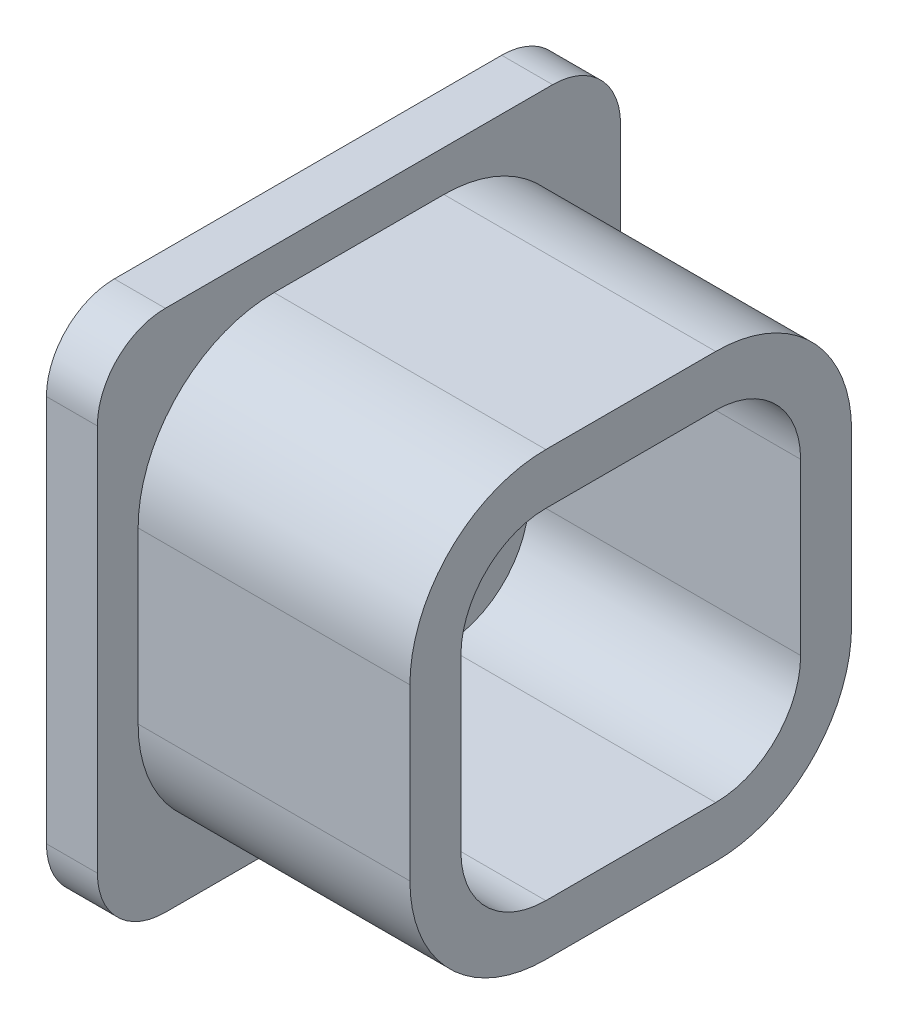
ISO-10303-21;
HEADER;
FILE_DESCRIPTION(('STEP AP214'),'2;1');
FILE_NAME('part.step','',(''),(''),'','','');
FILE_SCHEMA(('AUTOMOTIVE_DESIGN { 1 0 10303 214 1 1 1 1 }'));
ENDSEC;
DATA;
#1=APPLICATION_CONTEXT('core data for automotive mechanical design processes');
#2=APPLICATION_PROTOCOL_DEFINITION('international standard','automotive_design',2000,#1);
#3=PRODUCT_CONTEXT('',#1,'mechanical');
#4=PRODUCT('Part','Part','',(#3));
#5=PRODUCT_RELATED_PRODUCT_CATEGORY('part','',(#4));
#6=PRODUCT_DEFINITION_FORMATION('','',#4);
#7=PRODUCT_DEFINITION_CONTEXT('part definition',#1,'design');
#8=PRODUCT_DEFINITION('design','',#6,#7);
#9=PRODUCT_DEFINITION_SHAPE('','',#8);
#10=(LENGTH_UNIT() NAMED_UNIT(*) SI_UNIT(.MILLI.,.METRE.));
#11=(NAMED_UNIT(*) PLANE_ANGLE_UNIT() SI_UNIT($,.RADIAN.));
#12=(NAMED_UNIT(*) SI_UNIT($,.STERADIAN.) SOLID_ANGLE_UNIT());
#13=UNCERTAINTY_MEASURE_WITH_UNIT(LENGTH_MEASURE(1.E-05),#10,'distance_accuracy_value','');
#14=(GEOMETRIC_REPRESENTATION_CONTEXT(3) GLOBAL_UNCERTAINTY_ASSIGNED_CONTEXT((#13)) GLOBAL_UNIT_ASSIGNED_CONTEXT((#10,
#11,#12)) REPRESENTATION_CONTEXT('',''));
#15=CARTESIAN_POINT('',(0.,0.,0.));
#16=DIRECTION('',(0.,0.,1.));
#17=DIRECTION('',(1.,0.,0.));
#18=AXIS2_PLACEMENT_3D('',#15,#16,#17);
#19=CARTESIAN_POINT('',(9.5,0.,0.));
#20=DIRECTION('',(1.,0.,0.));
#21=DIRECTION('',(0.,0.,-1.));
#22=AXIS2_PLACEMENT_3D('',#19,#20,#21);
#23=PLANE('',#22);
#24=DIRECTION('',(0.,1.,0.));
#25=VECTOR('',#24,1.);
#26=CARTESIAN_POINT('',(9.5,-6.5,-6.5));
#27=LINE('',#26,#25);
#28=CARTESIAN_POINT('',(9.5,2.5,-6.5));
#29=VERTEX_POINT('',#28);
#30=CARTESIAN_POINT('',(9.5,-2.5,-6.5));
#31=VERTEX_POINT('',#30);
#32=EDGE_CURVE('E325',#29,#31,#27,.F.);
#33=ORIENTED_EDGE('',*,*,#32,.F.);
#34=CARTESIAN_POINT('',(9.5,2.5,-2.5));
#35=DIRECTION('',(-1.,0.,0.));
#36=DIRECTION('',(0.,0.,1.));
#37=AXIS2_PLACEMENT_3D('',#34,#35,#36);
#38=CIRCLE('',#37,4.);
#39=CARTESIAN_POINT('',(9.5,6.5,-2.5));
#40=VERTEX_POINT('',#39);
#41=EDGE_CURVE('E291',#40,#29,#38,.T.);
#42=ORIENTED_EDGE('',*,*,#41,.F.);
#43=DIRECTION('',(0.,0.,1.));
#44=VECTOR('',#43,1.);
#45=CARTESIAN_POINT('',(9.5,6.5,-6.5));
#46=LINE('',#45,#44);
#47=CARTESIAN_POINT('',(9.5,6.5,2.5));
#48=VERTEX_POINT('',#47);
#49=EDGE_CURVE('E322',#48,#40,#46,.F.);
#50=ORIENTED_EDGE('',*,*,#49,.F.);
#51=CARTESIAN_POINT('',(9.5,2.5,2.5));
#52=DIRECTION('',(-1.,0.,0.));
#53=DIRECTION('',(0.,0.,1.));
#54=AXIS2_PLACEMENT_3D('',#51,#52,#53);
#55=CIRCLE('',#54,4.);
#56=CARTESIAN_POINT('',(9.5,2.5,6.5));
#57=VERTEX_POINT('',#56);
#58=EDGE_CURVE('E286',#57,#48,#55,.T.);
#59=ORIENTED_EDGE('',*,*,#58,.F.);
#60=DIRECTION('',(0.,1.,0.));
#61=VECTOR('',#60,1.);
#62=CARTESIAN_POINT('',(9.5,6.5,6.5));
#63=LINE('',#62,#61);
#64=CARTESIAN_POINT('',(9.5,-2.5,6.5));
#65=VERTEX_POINT('',#64);
#66=EDGE_CURVE('E318',#65,#57,#63,.T.);
#67=ORIENTED_EDGE('',*,*,#66,.F.);
#68=CARTESIAN_POINT('',(9.5,-2.5,2.5));
#69=DIRECTION('',(-1.,0.,0.));
#70=DIRECTION('',(0.,0.,1.));
#71=AXIS2_PLACEMENT_3D('',#68,#69,#70);
#72=CIRCLE('',#71,4.);
#73=CARTESIAN_POINT('',(9.5,-6.5,2.5));
#74=VERTEX_POINT('',#73);
#75=EDGE_CURVE('E301',#74,#65,#72,.T.);
#76=ORIENTED_EDGE('',*,*,#75,.F.);
#77=DIRECTION('',(0.,0.,-1.));
#78=VECTOR('',#77,1.);
#79=CARTESIAN_POINT('',(9.5,-6.5,6.5));
#80=LINE('',#79,#78);
#81=CARTESIAN_POINT('',(9.5,-6.5,-2.5));
#82=VERTEX_POINT('',#81);
#83=EDGE_CURVE('E328',#82,#74,#80,.F.);
#84=ORIENTED_EDGE('',*,*,#83,.F.);
#85=CARTESIAN_POINT('',(9.5,-2.5,-2.5));
#86=DIRECTION('',(-1.,0.,0.));
#87=DIRECTION('',(0.,0.,1.));
#88=AXIS2_PLACEMENT_3D('',#85,#86,#87);
#89=CIRCLE('',#88,4.);
#90=EDGE_CURVE('E296',#31,#82,#89,.T.);
#91=ORIENTED_EDGE('',*,*,#90,.F.);
#92=EDGE_LOOP('',(#33,#42,#50,#59,#67,#76,#84,#91));
#93=FACE_BOUND('',#92,.T.);
#94=CARTESIAN_POINT('',(9.5,2.5,-2.5));
#95=DIRECTION('',(-1.,0.,0.));
#96=DIRECTION('',(0.,0.,1.));
#97=AXIS2_PLACEMENT_3D('',#94,#95,#96);
#98=CIRCLE('',#97,2.5);
#99=CARTESIAN_POINT('',(9.5,5.,-2.5));
#100=VERTEX_POINT('',#99);
#101=CARTESIAN_POINT('',(9.5,2.5,-5.));
#102=VERTEX_POINT('',#101);
#103=EDGE_CURVE('E305',#100,#102,#98,.T.);
#104=ORIENTED_EDGE('',*,*,#103,.T.);
#105=DIRECTION('',(0.,1.,0.));
#106=VECTOR('',#105,1.);
#107=CARTESIAN_POINT('',(9.5,-6.5,-5.));
#108=LINE('',#107,#106);
#109=CARTESIAN_POINT('',(9.5,-2.5,-5.));
#110=VERTEX_POINT('',#109);
#111=EDGE_CURVE('E331',#102,#110,#108,.F.);
#112=ORIENTED_EDGE('',*,*,#111,.T.);
#113=CARTESIAN_POINT('',(9.5,-2.5,-2.5));
#114=DIRECTION('',(-1.,0.,0.));
#115=DIRECTION('',(0.,0.,1.));
#116=AXIS2_PLACEMENT_3D('',#113,#114,#115);
#117=CIRCLE('',#116,2.5);
#118=CARTESIAN_POINT('',(9.5,-5.,-2.5));
#119=VERTEX_POINT('',#118);
#120=EDGE_CURVE('E307',#110,#119,#117,.T.);
#121=ORIENTED_EDGE('',*,*,#120,.T.);
#122=DIRECTION('',(0.,0.,-1.));
#123=VECTOR('',#122,1.);
#124=CARTESIAN_POINT('',(9.5,-5.,6.5));
#125=LINE('',#124,#123);
#126=CARTESIAN_POINT('',(9.5,-5.,2.5));
#127=VERTEX_POINT('',#126);
#128=EDGE_CURVE('E205',#119,#127,#125,.F.);
#129=ORIENTED_EDGE('',*,*,#128,.T.);
#130=CARTESIAN_POINT('',(9.5,-2.5,2.5));
#131=DIRECTION('',(-1.,0.,0.));
#132=DIRECTION('',(0.,0.,1.));
#133=AXIS2_PLACEMENT_3D('',#130,#131,#132);
#134=CIRCLE('',#133,2.5);
#135=CARTESIAN_POINT('',(9.5,-2.5,5.));
#136=VERTEX_POINT('',#135);
#137=EDGE_CURVE('E197',#127,#136,#134,.T.);
#138=ORIENTED_EDGE('',*,*,#137,.T.);
#139=DIRECTION('',(0.,1.,0.));
#140=VECTOR('',#139,1.);
#141=CARTESIAN_POINT('',(9.5,6.5,5.));
#142=LINE('',#141,#140);
#143=CARTESIAN_POINT('',(9.5,2.5,5.));
#144=VERTEX_POINT('',#143);
#145=EDGE_CURVE('E192',#136,#144,#142,.T.);
#146=ORIENTED_EDGE('',*,*,#145,.T.);
#147=CARTESIAN_POINT('',(9.5,2.5,2.5));
#148=DIRECTION('',(-1.,0.,0.));
#149=DIRECTION('',(0.,0.,1.));
#150=AXIS2_PLACEMENT_3D('',#147,#148,#149);
#151=CIRCLE('',#150,2.5);
#152=CARTESIAN_POINT('',(9.5,5.,2.5));
#153=VERTEX_POINT('',#152);
#154=EDGE_CURVE('E20',#144,#153,#151,.T.);
#155=ORIENTED_EDGE('',*,*,#154,.T.);
#156=DIRECTION('',(0.,0.,1.));
#157=VECTOR('',#156,1.);
#158=CARTESIAN_POINT('',(9.5,5.,-6.5));
#159=LINE('',#158,#157);
#160=EDGE_CURVE('E180',#153,#100,#159,.F.);
#161=ORIENTED_EDGE('',*,*,#160,.T.);
#162=EDGE_LOOP('',(#104,#112,#121,#129,#138,#146,#155,#161));
#163=FACE_BOUND('',#162,.T.);
#164=ADVANCED_FACE('F17',(#93,#163),#23,.T.);
#165=CARTESIAN_POINT('',(0.,5.,-6.5));
#166=DIRECTION('',(0.,1.,0.));
#167=DIRECTION('',(0.,0.,1.));
#168=AXIS2_PLACEMENT_3D('',#165,#166,#167);
#169=PLANE('',#168);
#170=DIRECTION('',(-1.,0.,0.));
#171=VECTOR('',#170,1.);
#172=CARTESIAN_POINT('',(9.532380992134,5.,-2.5));
#173=LINE('',#172,#171);
#174=CARTESIAN_POINT('',(1.5,5.,-2.5));
#175=VERTEX_POINT('',#174);
#176=EDGE_CURVE('E185',#175,#100,#173,.F.);
#177=ORIENTED_EDGE('',*,*,#176,.T.);
#178=ORIENTED_EDGE('',*,*,#160,.F.);
#179=DIRECTION('',(-1.,0.,0.));
#180=VECTOR('',#179,1.);
#181=CARTESIAN_POINT('',(9.532380992134,5.,2.5));
#182=LINE('',#181,#180);
#183=CARTESIAN_POINT('',(1.5,5.,2.5));
#184=VERTEX_POINT('',#183);
#185=EDGE_CURVE('E183',#153,#184,#182,.T.);
#186=ORIENTED_EDGE('',*,*,#185,.T.);
#187=DIRECTION('',(0.,0.,-1.));
#188=VECTOR('',#187,1.);
#189=CARTESIAN_POINT('',(1.5,5.,0.));
#190=LINE('',#189,#188);
#191=EDGE_CURVE('E285',#175,#184,#190,.F.);
#192=ORIENTED_EDGE('',*,*,#191,.F.);
#193=EDGE_LOOP('',(#177,#178,#186,#192));
#194=FACE_BOUND('',#193,.T.);
#195=ADVANCED_FACE('F181',(#194),#169,.F.);
#196=CARTESIAN_POINT('',(9.532380992134,2.5,2.5));
#197=DIRECTION('',(-1.,0.,0.));
#198=DIRECTION('',(0.,0.,1.));
#199=AXIS2_PLACEMENT_3D('',#196,#197,#198);
#200=CYLINDRICAL_SURFACE('',#199,2.5);
#201=ORIENTED_EDGE('',*,*,#185,.F.);
#202=ORIENTED_EDGE('',*,*,#154,.F.);
#203=DIRECTION('',(1.,0.,0.));
#204=VECTOR('',#203,1.);
#205=CARTESIAN_POINT('',(0.,2.5,5.));
#206=LINE('',#205,#204);
#207=CARTESIAN_POINT('',(1.5,2.5,5.));
#208=VERTEX_POINT('',#207);
#209=EDGE_CURVE('E201',#144,#208,#206,.F.);
#210=ORIENTED_EDGE('',*,*,#209,.T.);
#211=CARTESIAN_POINT('',(1.5,2.5,2.5));
#212=DIRECTION('',(-1.,0.,0.));
#213=DIRECTION('',(0.,0.,1.));
#214=AXIS2_PLACEMENT_3D('',#211,#212,#213);
#215=CIRCLE('',#214,2.5);
#216=EDGE_CURVE('E191',#184,#208,#215,.F.);
#217=ORIENTED_EDGE('',*,*,#216,.F.);
#218=EDGE_LOOP('',(#201,#202,#210,#217));
#219=FACE_BOUND('',#218,.T.);
#220=ADVANCED_FACE('F190',(#219),#200,.F.);
#221=CARTESIAN_POINT('',(0.,6.5,5.));
#222=DIRECTION('',(0.,0.,1.));
#223=DIRECTION('',(1.,0.,0.));
#224=AXIS2_PLACEMENT_3D('',#221,#222,#223);
#225=PLANE('',#224);
#226=ORIENTED_EDGE('',*,*,#209,.F.);
#227=ORIENTED_EDGE('',*,*,#145,.F.);
#228=DIRECTION('',(-1.,0.,0.));
#229=VECTOR('',#228,1.);
#230=CARTESIAN_POINT('',(9.532380992134,-2.5,5.));
#231=LINE('',#230,#229);
#232=CARTESIAN_POINT('',(1.5,-2.5,5.));
#233=VERTEX_POINT('',#232);
#234=EDGE_CURVE('E311',#136,#233,#231,.T.);
#235=ORIENTED_EDGE('',*,*,#234,.T.);
#236=DIRECTION('',(0.,1.,0.));
#237=VECTOR('',#236,1.);
#238=CARTESIAN_POINT('',(1.5,0.,5.));
#239=LINE('',#238,#237);
#240=EDGE_CURVE('E283',#208,#233,#239,.F.);
#241=ORIENTED_EDGE('',*,*,#240,.F.);
#242=EDGE_LOOP('',(#226,#227,#235,#241));
#243=FACE_BOUND('',#242,.T.);
#244=ADVANCED_FACE('F524',(#243),#225,.F.);
#245=CARTESIAN_POINT('',(9.532380992134,-2.5,2.5));
#246=DIRECTION('',(-1.,0.,0.));
#247=DIRECTION('',(0.,0.,1.));
#248=AXIS2_PLACEMENT_3D('',#245,#246,#247);
#249=CYLINDRICAL_SURFACE('',#248,2.5);
#250=ORIENTED_EDGE('',*,*,#234,.F.);
#251=ORIENTED_EDGE('',*,*,#137,.F.);
#252=DIRECTION('',(1.,0.,0.));
#253=VECTOR('',#252,1.);
#254=CARTESIAN_POINT('',(0.,-5.,2.5));
#255=LINE('',#254,#253);
#256=CARTESIAN_POINT('',(1.5,-5.,2.5));
#257=VERTEX_POINT('',#256);
#258=EDGE_CURVE('E310',#127,#257,#255,.F.);
#259=ORIENTED_EDGE('',*,*,#258,.T.);
#260=CARTESIAN_POINT('',(1.5,-2.5,2.5));
#261=DIRECTION('',(-1.,0.,0.));
#262=DIRECTION('',(0.,0.,1.));
#263=AXIS2_PLACEMENT_3D('',#260,#261,#262);
#264=CIRCLE('',#263,2.5);
#265=EDGE_CURVE('E281',#233,#257,#264,.F.);
#266=ORIENTED_EDGE('',*,*,#265,.F.);
#267=EDGE_LOOP('',(#250,#251,#259,#266));
#268=FACE_BOUND('',#267,.T.);
#269=ADVANCED_FACE('F521',(#268),#249,.F.);
#270=CARTESIAN_POINT('',(0.,-5.,6.5));
#271=DIRECTION('',(0.,-1.,0.));
#272=DIRECTION('',(0.,0.,-1.));
#273=AXIS2_PLACEMENT_3D('',#270,#271,#272);
#274=PLANE('',#273);
#275=ORIENTED_EDGE('',*,*,#258,.F.);
#276=ORIENTED_EDGE('',*,*,#128,.F.);
#277=DIRECTION('',(-1.,0.,0.));
#278=VECTOR('',#277,1.);
#279=CARTESIAN_POINT('',(9.532380992134,-5.,-2.5));
#280=LINE('',#279,#278);
#281=CARTESIAN_POINT('',(1.5,-5.,-2.5));
#282=VERTEX_POINT('',#281);
#283=EDGE_CURVE('E309',#119,#282,#280,.T.);
#284=ORIENTED_EDGE('',*,*,#283,.T.);
#285=DIRECTION('',(0.,0.,-1.));
#286=VECTOR('',#285,1.);
#287=CARTESIAN_POINT('',(1.5,-5.,0.));
#288=LINE('',#287,#286);
#289=EDGE_CURVE('E280',#257,#282,#288,.T.);
#290=ORIENTED_EDGE('',*,*,#289,.F.);
#291=EDGE_LOOP('',(#275,#276,#284,#290));
#292=FACE_BOUND('',#291,.T.);
#293=ADVANCED_FACE('F517',(#292),#274,.F.);
#294=CARTESIAN_POINT('',(9.532380992134,-2.5,-2.5));
#295=DIRECTION('',(-1.,0.,0.));
#296=DIRECTION('',(0.,0.,1.));
#297=AXIS2_PLACEMENT_3D('',#294,#295,#296);
#298=CYLINDRICAL_SURFACE('',#297,2.5);
#299=ORIENTED_EDGE('',*,*,#283,.F.);
#300=ORIENTED_EDGE('',*,*,#120,.F.);
#301=DIRECTION('',(-1.,0.,0.));
#302=VECTOR('',#301,1.);
#303=CARTESIAN_POINT('',(0.,-2.5,-5.));
#304=LINE('',#303,#302);
#305=CARTESIAN_POINT('',(1.5,-2.5,-5.));
#306=VERTEX_POINT('',#305);
#307=EDGE_CURVE('E333',#110,#306,#304,.T.);
#308=ORIENTED_EDGE('',*,*,#307,.T.);
#309=CARTESIAN_POINT('',(1.5,-2.5,-2.5));
#310=DIRECTION('',(-1.,0.,0.));
#311=DIRECTION('',(0.,0.,1.));
#312=AXIS2_PLACEMENT_3D('',#309,#310,#311);
#313=CIRCLE('',#312,2.5);
#314=EDGE_CURVE('E278',#282,#306,#313,.F.);
#315=ORIENTED_EDGE('',*,*,#314,.F.);
#316=EDGE_LOOP('',(#299,#300,#308,#315));
#317=FACE_BOUND('',#316,.T.);
#318=ADVANCED_FACE('F513',(#317),#298,.F.);
#319=CARTESIAN_POINT('',(0.,-6.5,-5.));
#320=DIRECTION('',(0.,0.,-1.));
#321=DIRECTION('',(-1.,0.,0.));
#322=AXIS2_PLACEMENT_3D('',#319,#320,#321);
#323=PLANE('',#322);
#324=ORIENTED_EDGE('',*,*,#307,.F.);
#325=ORIENTED_EDGE('',*,*,#111,.F.);
#326=DIRECTION('',(-1.,0.,0.));
#327=VECTOR('',#326,1.);
#328=CARTESIAN_POINT('',(9.532380992134,2.5,-5.));
#329=LINE('',#328,#327);
#330=CARTESIAN_POINT('',(1.5,2.5,-5.));
#331=VERTEX_POINT('',#330);
#332=EDGE_CURVE('E304',#102,#331,#329,.T.);
#333=ORIENTED_EDGE('',*,*,#332,.T.);
#334=DIRECTION('',(0.,1.,0.));
#335=VECTOR('',#334,1.);
#336=CARTESIAN_POINT('',(1.5,0.,-5.));
#337=LINE('',#336,#335);
#338=EDGE_CURVE('E277',#306,#331,#337,.T.);
#339=ORIENTED_EDGE('',*,*,#338,.F.);
#340=EDGE_LOOP('',(#324,#325,#333,#339));
#341=FACE_BOUND('',#340,.T.);
#342=ADVANCED_FACE('F509',(#341),#323,.F.);
#343=CARTESIAN_POINT('',(9.532380992134,2.5,-2.5));
#344=DIRECTION('',(-1.,0.,0.));
#345=DIRECTION('',(0.,0.,1.));
#346=AXIS2_PLACEMENT_3D('',#343,#344,#345);
#347=CYLINDRICAL_SURFACE('',#346,2.5);
#348=ORIENTED_EDGE('',*,*,#332,.F.);
#349=ORIENTED_EDGE('',*,*,#103,.F.);
#350=ORIENTED_EDGE('',*,*,#176,.F.);
#351=CARTESIAN_POINT('',(1.5,2.5,-2.5));
#352=DIRECTION('',(-1.,0.,0.));
#353=DIRECTION('',(0.,0.,1.));
#354=AXIS2_PLACEMENT_3D('',#351,#352,#353);
#355=CIRCLE('',#354,2.5);
#356=EDGE_CURVE('E274',#331,#175,#355,.F.);
#357=ORIENTED_EDGE('',*,*,#356,.F.);
#358=EDGE_LOOP('',(#348,#349,#350,#357));
#359=FACE_BOUND('',#358,.T.);
#360=ADVANCED_FACE('F505',(#359),#347,.F.);
#361=CARTESIAN_POINT('',(9.532380992134,-2.5,2.5));
#362=DIRECTION('',(-1.,0.,0.));
#363=DIRECTION('',(0.,0.,1.));
#364=AXIS2_PLACEMENT_3D('',#361,#362,#363);
#365=CYLINDRICAL_SURFACE('',#364,4.);
#366=DIRECTION('',(1.,0.,0.));
#367=VECTOR('',#366,1.);
#368=CARTESIAN_POINT('',(0.,-6.5,2.5));
#369=LINE('',#368,#367);
#370=CARTESIAN_POINT('',(1.5,-6.5,2.5));
#371=VERTEX_POINT('',#370);
#372=EDGE_CURVE('E303',#74,#371,#369,.F.);
#373=ORIENTED_EDGE('',*,*,#372,.F.);
#374=ORIENTED_EDGE('',*,*,#75,.T.);
#375=DIRECTION('',(1.,0.,0.));
#376=VECTOR('',#375,1.);
#377=CARTESIAN_POINT('',(0.,-2.5,6.5));
#378=LINE('',#377,#376);
#379=CARTESIAN_POINT('',(1.5,-2.5,6.5));
#380=VERTEX_POINT('',#379);
#381=EDGE_CURVE('E321',#380,#65,#378,.T.);
#382=ORIENTED_EDGE('',*,*,#381,.F.);
#383=CARTESIAN_POINT('',(1.5,-2.5,2.5));
#384=DIRECTION('',(-1.,0.,0.));
#385=DIRECTION('',(0.,0.,1.));
#386=AXIS2_PLACEMENT_3D('',#383,#384,#385);
#387=CIRCLE('',#386,4.);
#388=EDGE_CURVE('E271',#380,#371,#387,.F.);
#389=ORIENTED_EDGE('',*,*,#388,.T.);
#390=EDGE_LOOP('',(#373,#374,#382,#389));
#391=FACE_BOUND('',#390,.T.);
#392=ADVANCED_FACE('F501',(#391),#365,.T.);
#393=CARTESIAN_POINT('',(0.,-6.5,6.5));
#394=DIRECTION('',(0.,-1.,0.));
#395=DIRECTION('',(0.,0.,-1.));
#396=AXIS2_PLACEMENT_3D('',#393,#394,#395);
#397=PLANE('',#396);
#398=DIRECTION('',(-1.,0.,0.));
#399=VECTOR('',#398,1.);
#400=CARTESIAN_POINT('',(9.532380992134,-6.5,-2.5));
#401=LINE('',#400,#399);
#402=CARTESIAN_POINT('',(1.5,-6.5,-2.5));
#403=VERTEX_POINT('',#402);
#404=EDGE_CURVE('E300',#82,#403,#401,.T.);
#405=ORIENTED_EDGE('',*,*,#404,.F.);
#406=ORIENTED_EDGE('',*,*,#83,.T.);
#407=ORIENTED_EDGE('',*,*,#372,.T.);
#408=DIRECTION('',(0.,0.,1.));
#409=VECTOR('',#408,1.);
#410=CARTESIAN_POINT('',(1.5,-6.5,0.));
#411=LINE('',#410,#409);
#412=EDGE_CURVE('E270',#371,#403,#411,.F.);
#413=ORIENTED_EDGE('',*,*,#412,.T.);
#414=EDGE_LOOP('',(#405,#406,#407,#413));
#415=FACE_BOUND('',#414,.T.);
#416=ADVANCED_FACE('F497',(#415),#397,.T.);
#417=CARTESIAN_POINT('',(9.532380992134,-2.5,-2.5));
#418=DIRECTION('',(-1.,0.,0.));
#419=DIRECTION('',(0.,0.,1.));
#420=AXIS2_PLACEMENT_3D('',#417,#418,#419);
#421=CYLINDRICAL_SURFACE('',#420,4.);
#422=DIRECTION('',(-1.,0.,0.));
#423=VECTOR('',#422,1.);
#424=CARTESIAN_POINT('',(0.,-2.5,-6.5));
#425=LINE('',#424,#423);
#426=CARTESIAN_POINT('',(1.5,-2.5,-6.5));
#427=VERTEX_POINT('',#426);
#428=EDGE_CURVE('E299',#31,#427,#425,.T.);
#429=ORIENTED_EDGE('',*,*,#428,.F.);
#430=ORIENTED_EDGE('',*,*,#90,.T.);
#431=ORIENTED_EDGE('',*,*,#404,.T.);
#432=CARTESIAN_POINT('',(1.5,-2.5,-2.5));
#433=DIRECTION('',(-1.,0.,0.));
#434=DIRECTION('',(0.,0.,1.));
#435=AXIS2_PLACEMENT_3D('',#432,#433,#434);
#436=CIRCLE('',#435,4.);
#437=EDGE_CURVE('E267',#403,#427,#436,.F.);
#438=ORIENTED_EDGE('',*,*,#437,.T.);
#439=EDGE_LOOP('',(#429,#430,#431,#438));
#440=FACE_BOUND('',#439,.T.);
#441=ADVANCED_FACE('F493',(#440),#421,.T.);
#442=CARTESIAN_POINT('',(0.,-6.5,-6.5));
#443=DIRECTION('',(0.,0.,-1.));
#444=DIRECTION('',(-1.,0.,0.));
#445=AXIS2_PLACEMENT_3D('',#442,#443,#444);
#446=PLANE('',#445);
#447=DIRECTION('',(-1.,0.,0.));
#448=VECTOR('',#447,1.);
#449=CARTESIAN_POINT('',(9.532380992134,2.5,-6.5));
#450=LINE('',#449,#448);
#451=CARTESIAN_POINT('',(1.5,2.5,-6.5));
#452=VERTEX_POINT('',#451);
#453=EDGE_CURVE('E295',#29,#452,#450,.T.);
#454=ORIENTED_EDGE('',*,*,#453,.F.);
#455=ORIENTED_EDGE('',*,*,#32,.T.);
#456=ORIENTED_EDGE('',*,*,#428,.T.);
#457=DIRECTION('',(0.,1.,0.));
#458=VECTOR('',#457,1.);
#459=CARTESIAN_POINT('',(1.5,0.,-6.5));
#460=LINE('',#459,#458);
#461=EDGE_CURVE('E266',#427,#452,#460,.T.);
#462=ORIENTED_EDGE('',*,*,#461,.T.);
#463=EDGE_LOOP('',(#454,#455,#456,#462));
#464=FACE_BOUND('',#463,.T.);
#465=ADVANCED_FACE('F489',(#464),#446,.T.);
#466=CARTESIAN_POINT('',(9.532380992134,2.5,-2.5));
#467=DIRECTION('',(-1.,0.,0.));
#468=DIRECTION('',(0.,0.,1.));
#469=AXIS2_PLACEMENT_3D('',#466,#467,#468);
#470=CYLINDRICAL_SURFACE('',#469,4.);
#471=DIRECTION('',(1.,0.,0.));
#472=VECTOR('',#471,1.);
#473=CARTESIAN_POINT('',(0.,6.5,-2.5));
#474=LINE('',#473,#472);
#475=CARTESIAN_POINT('',(1.5,6.5,-2.5));
#476=VERTEX_POINT('',#475);
#477=EDGE_CURVE('E294',#40,#476,#474,.F.);
#478=ORIENTED_EDGE('',*,*,#477,.F.);
#479=ORIENTED_EDGE('',*,*,#41,.T.);
#480=ORIENTED_EDGE('',*,*,#453,.T.);
#481=CARTESIAN_POINT('',(1.5,2.5,-2.5));
#482=DIRECTION('',(-1.,0.,0.));
#483=DIRECTION('',(0.,0.,1.));
#484=AXIS2_PLACEMENT_3D('',#481,#482,#483);
#485=CIRCLE('',#484,4.);
#486=EDGE_CURVE('E263',#452,#476,#485,.F.);
#487=ORIENTED_EDGE('',*,*,#486,.T.);
#488=EDGE_LOOP('',(#478,#479,#480,#487));
#489=FACE_BOUND('',#488,.T.);
#490=ADVANCED_FACE('F485',(#489),#470,.T.);
#491=CARTESIAN_POINT('',(0.,6.5,-6.5));
#492=DIRECTION('',(0.,1.,0.));
#493=DIRECTION('',(0.,0.,1.));
#494=AXIS2_PLACEMENT_3D('',#491,#492,#493);
#495=PLANE('',#494);
#496=DIRECTION('',(-1.,0.,0.));
#497=VECTOR('',#496,1.);
#498=CARTESIAN_POINT('',(9.532380992134,6.5,2.5));
#499=LINE('',#498,#497);
#500=CARTESIAN_POINT('',(1.5,6.5,2.5));
#501=VERTEX_POINT('',#500);
#502=EDGE_CURVE('E290',#48,#501,#499,.T.);
#503=ORIENTED_EDGE('',*,*,#502,.F.);
#504=ORIENTED_EDGE('',*,*,#49,.T.);
#505=ORIENTED_EDGE('',*,*,#477,.T.);
#506=DIRECTION('',(0.,0.,1.));
#507=VECTOR('',#506,1.);
#508=CARTESIAN_POINT('',(1.5,6.5,0.));
#509=LINE('',#508,#507);
#510=EDGE_CURVE('E262',#476,#501,#509,.T.);
#511=ORIENTED_EDGE('',*,*,#510,.T.);
#512=EDGE_LOOP('',(#503,#504,#505,#511));
#513=FACE_BOUND('',#512,.T.);
#514=ADVANCED_FACE('F481',(#513),#495,.T.);
#515=CARTESIAN_POINT('',(9.532380992134,2.5,2.5));
#516=DIRECTION('',(-1.,0.,0.));
#517=DIRECTION('',(0.,0.,1.));
#518=AXIS2_PLACEMENT_3D('',#515,#516,#517);
#519=CYLINDRICAL_SURFACE('',#518,4.);
#520=DIRECTION('',(1.,0.,0.));
#521=VECTOR('',#520,1.);
#522=CARTESIAN_POINT('',(0.,2.5,6.5));
#523=LINE('',#522,#521);
#524=CARTESIAN_POINT('',(1.5,2.5,6.5));
#525=VERTEX_POINT('',#524);
#526=EDGE_CURVE('E289',#57,#525,#523,.F.);
#527=ORIENTED_EDGE('',*,*,#526,.F.);
#528=ORIENTED_EDGE('',*,*,#58,.T.);
#529=ORIENTED_EDGE('',*,*,#502,.T.);
#530=CARTESIAN_POINT('',(1.5,2.5,2.5));
#531=DIRECTION('',(-1.,0.,0.));
#532=DIRECTION('',(0.,0.,1.));
#533=AXIS2_PLACEMENT_3D('',#530,#531,#532);
#534=CIRCLE('',#533,4.);
#535=EDGE_CURVE('E259',#501,#525,#534,.F.);
#536=ORIENTED_EDGE('',*,*,#535,.T.);
#537=EDGE_LOOP('',(#527,#528,#529,#536));
#538=FACE_BOUND('',#537,.T.);
#539=ADVANCED_FACE('F477',(#538),#519,.T.);
#540=CARTESIAN_POINT('',(0.,6.5,6.5));
#541=DIRECTION('',(0.,0.,1.));
#542=DIRECTION('',(1.,0.,0.));
#543=AXIS2_PLACEMENT_3D('',#540,#541,#542);
#544=PLANE('',#543);
#545=ORIENTED_EDGE('',*,*,#381,.T.);
#546=ORIENTED_EDGE('',*,*,#66,.T.);
#547=ORIENTED_EDGE('',*,*,#526,.T.);
#548=DIRECTION('',(0.,1.,0.));
#549=VECTOR('',#548,1.);
#550=CARTESIAN_POINT('',(1.5,0.,6.5));
#551=LINE('',#550,#549);
#552=EDGE_CURVE('E258',#525,#380,#551,.F.);
#553=ORIENTED_EDGE('',*,*,#552,.T.);
#554=EDGE_LOOP('',(#545,#546,#547,#553));
#555=FACE_BOUND('',#554,.T.);
#556=ADVANCED_FACE('F473',(#555),#544,.T.);
#557=CARTESIAN_POINT('',(1.5,0.,0.));
#558=DIRECTION('',(1.,0.,0.));
#559=DIRECTION('',(0.,0.,-1.));
#560=AXIS2_PLACEMENT_3D('',#557,#558,#559);
#561=PLANE('',#560);
#562=ORIENTED_EDGE('',*,*,#338,.T.);
#563=ORIENTED_EDGE('',*,*,#356,.T.);
#564=ORIENTED_EDGE('',*,*,#191,.T.);
#565=ORIENTED_EDGE('',*,*,#216,.T.);
#566=ORIENTED_EDGE('',*,*,#240,.T.);
#567=ORIENTED_EDGE('',*,*,#265,.T.);
#568=ORIENTED_EDGE('',*,*,#289,.T.);
#569=ORIENTED_EDGE('',*,*,#314,.T.);
#570=EDGE_LOOP('',(#562,#563,#564,#565,#566,#567,#568,#569));
#571=FACE_BOUND('',#570,.T.);
#572=CARTESIAN_POINT('',(1.5,-2.5,-2.5));
#573=DIRECTION('',(1.,0.,0.));
#574=DIRECTION('',(0.,0.,-1.));
#575=AXIS2_PLACEMENT_3D('',#572,#573,#574);
#576=CIRCLE('',#575,1.75);
#577=CARTESIAN_POINT('',(1.5,-2.5,-4.25));
#578=VERTEX_POINT('',#577);
#579=EDGE_CURVE('E246',#578,#578,#576,.F.);
#580=ORIENTED_EDGE('',*,*,#579,.T.);
#581=EDGE_LOOP('',(#580));
#582=FACE_BOUND('',#581,.T.);
#583=CARTESIAN_POINT('',(1.5,2.5,-2.5));
#584=DIRECTION('',(1.,0.,0.));
#585=DIRECTION('',(0.,0.,-1.));
#586=AXIS2_PLACEMENT_3D('',#583,#584,#585);
#587=CIRCLE('',#586,1.75);
#588=CARTESIAN_POINT('',(1.5,2.5,-4.25));
#589=VERTEX_POINT('',#588);
#590=EDGE_CURVE('E249',#589,#589,#587,.F.);
#591=ORIENTED_EDGE('',*,*,#590,.T.);
#592=EDGE_LOOP('',(#591));
#593=FACE_BOUND('',#592,.T.);
#594=CARTESIAN_POINT('',(1.5,2.5,2.5));
#595=DIRECTION('',(1.,0.,0.));
#596=DIRECTION('',(0.,0.,-1.));
#597=AXIS2_PLACEMENT_3D('',#594,#595,#596);
#598=CIRCLE('',#597,1.75);
#599=CARTESIAN_POINT('',(1.5,2.5,0.75));
#600=VERTEX_POINT('',#599);
#601=EDGE_CURVE('E252',#600,#600,#598,.F.);
#602=ORIENTED_EDGE('',*,*,#601,.T.);
#603=EDGE_LOOP('',(#602));
#604=FACE_BOUND('',#603,.T.);
#605=CARTESIAN_POINT('',(1.5,-2.5,2.5));
#606=DIRECTION('',(1.,0.,0.));
#607=DIRECTION('',(0.,0.,-1.));
#608=AXIS2_PLACEMENT_3D('',#605,#606,#607);
#609=CIRCLE('',#608,1.75);
#610=CARTESIAN_POINT('',(1.5,-2.5,0.75));
#611=VERTEX_POINT('',#610);
#612=EDGE_CURVE('E255',#611,#611,#609,.F.);
#613=ORIENTED_EDGE('',*,*,#612,.T.);
#614=EDGE_LOOP('',(#613));
#615=FACE_BOUND('',#614,.T.);
#616=ADVANCED_FACE('F469',(#571,#582,#593,#604,#615),#561,.T.);
#617=CARTESIAN_POINT('',(1.5,0.,0.));
#618=DIRECTION('',(-1.,0.,0.));
#619=DIRECTION('',(0.,0.,1.));
#620=AXIS2_PLACEMENT_3D('',#617,#618,#619);
#621=PLANE('',#620);
#622=DIRECTION('',(0.,0.,1.));
#623=VECTOR('',#622,1.);
#624=CARTESIAN_POINT('',(1.5,7.7,7.7));
#625=LINE('',#624,#623);
#626=CARTESIAN_POINT('',(1.5,7.7,5.7));
#627=VERTEX_POINT('',#626);
#628=CARTESIAN_POINT('',(1.5,7.7,-5.7));
#629=VERTEX_POINT('',#628);
#630=EDGE_CURVE('E360',#627,#629,#625,.F.);
#631=ORIENTED_EDGE('',*,*,#630,.F.);
#632=CARTESIAN_POINT('',(1.5,5.7,5.7));
#633=DIRECTION('',(1.,0.,0.));
#634=DIRECTION('',(0.,0.,-1.));
#635=AXIS2_PLACEMENT_3D('',#632,#633,#634);
#636=CIRCLE('',#635,2.);
#637=CARTESIAN_POINT('',(1.5,5.7,7.7));
#638=VERTEX_POINT('',#637);
#639=EDGE_CURVE('E234',#638,#627,#636,.F.);
#640=ORIENTED_EDGE('',*,*,#639,.F.);
#641=DIRECTION('',(0.,1.,0.));
#642=VECTOR('',#641,1.);
#643=CARTESIAN_POINT('',(1.5,-7.7,7.7));
#644=LINE('',#643,#642);
#645=CARTESIAN_POINT('',(1.5,-5.7,7.7));
#646=VERTEX_POINT('',#645);
#647=EDGE_CURVE('E371',#646,#638,#644,.T.);
#648=ORIENTED_EDGE('',*,*,#647,.F.);
#649=CARTESIAN_POINT('',(1.5,-5.7,5.7));
#650=DIRECTION('',(1.,0.,0.));
#651=DIRECTION('',(0.,0.,-1.));
#652=AXIS2_PLACEMENT_3D('',#649,#650,#651);
#653=CIRCLE('',#652,2.);
#654=CARTESIAN_POINT('',(1.5,-7.7,5.7));
#655=VERTEX_POINT('',#654);
#656=EDGE_CURVE('E231',#655,#646,#653,.F.);
#657=ORIENTED_EDGE('',*,*,#656,.F.);
#658=DIRECTION('',(0.,0.,-1.));
#659=VECTOR('',#658,1.);
#660=CARTESIAN_POINT('',(1.5,-7.7,-7.7));
#661=LINE('',#660,#659);
#662=CARTESIAN_POINT('',(1.5,-7.7,-5.7));
#663=VERTEX_POINT('',#662);
#664=EDGE_CURVE('E245',#663,#655,#661,.F.);
#665=ORIENTED_EDGE('',*,*,#664,.F.);
#666=CARTESIAN_POINT('',(1.5,-5.7,-5.7));
#667=DIRECTION('',(1.,0.,0.));
#668=DIRECTION('',(0.,0.,-1.));
#669=AXIS2_PLACEMENT_3D('',#666,#667,#668);
#670=CIRCLE('',#669,2.);
#671=CARTESIAN_POINT('',(1.5,-5.7,-7.7));
#672=VERTEX_POINT('',#671);
#673=EDGE_CURVE('E242',#672,#663,#670,.F.);
#674=ORIENTED_EDGE('',*,*,#673,.F.);
#675=DIRECTION('',(0.,1.,0.));
#676=VECTOR('',#675,1.);
#677=CARTESIAN_POINT('',(1.5,7.7,-7.7));
#678=LINE('',#677,#676);
#679=CARTESIAN_POINT('',(1.5,5.7,-7.7));
#680=VERTEX_POINT('',#679);
#681=EDGE_CURVE('E358',#680,#672,#678,.F.);
#682=ORIENTED_EDGE('',*,*,#681,.F.);
#683=CARTESIAN_POINT('',(1.5,5.7,-5.7));
#684=DIRECTION('',(1.,0.,0.));
#685=DIRECTION('',(0.,0.,-1.));
#686=AXIS2_PLACEMENT_3D('',#683,#684,#685);
#687=CIRCLE('',#686,2.);
#688=EDGE_CURVE('E238',#629,#680,#687,.F.);
#689=ORIENTED_EDGE('',*,*,#688,.F.);
#690=EDGE_LOOP('',(#631,#640,#648,#657,#665,#674,#682,#689));
#691=FACE_BOUND('',#690,.T.);
#692=ORIENTED_EDGE('',*,*,#535,.F.);
#693=ORIENTED_EDGE('',*,*,#510,.F.);
#694=ORIENTED_EDGE('',*,*,#486,.F.);
#695=ORIENTED_EDGE('',*,*,#461,.F.);
#696=ORIENTED_EDGE('',*,*,#437,.F.);
#697=ORIENTED_EDGE('',*,*,#412,.F.);
#698=ORIENTED_EDGE('',*,*,#388,.F.);
#699=ORIENTED_EDGE('',*,*,#552,.F.);
#700=EDGE_LOOP('',(#692,#693,#694,#695,#696,#697,#698,#699));
#701=FACE_BOUND('',#700,.T.);
#702=ADVANCED_FACE('F465',(#691,#701),#621,.F.);
#703=CARTESIAN_POINT('',(9.5,-2.5,2.5));
#704=DIRECTION('',(1.,0.,0.));
#705=DIRECTION('',(0.,0.,-1.));
#706=AXIS2_PLACEMENT_3D('',#703,#704,#705);
#707=CYLINDRICAL_SURFACE('',#706,1.75);
#708=ORIENTED_EDGE('',*,*,#612,.F.);
#709=EDGE_LOOP('',(#708));
#710=FACE_BOUND('',#709,.T.);
#711=CARTESIAN_POINT('',(0.,-2.5,2.5));
#712=DIRECTION('',(1.,0.,0.));
#713=DIRECTION('',(0.,0.,-1.));
#714=AXIS2_PLACEMENT_3D('',#711,#712,#713);
#715=CIRCLE('',#714,1.75);
#716=CARTESIAN_POINT('',(0.,-2.5,0.75));
#717=VERTEX_POINT('',#716);
#718=EDGE_CURVE('E228',#717,#717,#715,.F.);
#719=ORIENTED_EDGE('',*,*,#718,.T.);
#720=EDGE_LOOP('',(#719));
#721=FACE_BOUND('',#720,.T.);
#722=ADVANCED_FACE('F461',(#710,#721),#707,.F.);
#723=CARTESIAN_POINT('',(9.5,2.5,2.5));
#724=DIRECTION('',(1.,0.,0.));
#725=DIRECTION('',(0.,0.,-1.));
#726=AXIS2_PLACEMENT_3D('',#723,#724,#725);
#727=CYLINDRICAL_SURFACE('',#726,1.75);
#728=ORIENTED_EDGE('',*,*,#601,.F.);
#729=EDGE_LOOP('',(#728));
#730=FACE_BOUND('',#729,.T.);
#731=CARTESIAN_POINT('',(0.,2.5,2.5));
#732=DIRECTION('',(1.,0.,0.));
#733=DIRECTION('',(0.,0.,-1.));
#734=AXIS2_PLACEMENT_3D('',#731,#732,#733);
#735=CIRCLE('',#734,1.75);
#736=CARTESIAN_POINT('',(0.,2.5,0.75));
#737=VERTEX_POINT('',#736);
#738=EDGE_CURVE('E225',#737,#737,#735,.F.);
#739=ORIENTED_EDGE('',*,*,#738,.T.);
#740=EDGE_LOOP('',(#739));
#741=FACE_BOUND('',#740,.T.);
#742=ADVANCED_FACE('F457',(#730,#741),#727,.F.);
#743=CARTESIAN_POINT('',(9.5,2.5,-2.5));
#744=DIRECTION('',(1.,0.,0.));
#745=DIRECTION('',(0.,0.,-1.));
#746=AXIS2_PLACEMENT_3D('',#743,#744,#745);
#747=CYLINDRICAL_SURFACE('',#746,1.75);
#748=ORIENTED_EDGE('',*,*,#590,.F.);
#749=EDGE_LOOP('',(#748));
#750=FACE_BOUND('',#749,.T.);
#751=CARTESIAN_POINT('',(0.,2.5,-2.5));
#752=DIRECTION('',(1.,0.,0.));
#753=DIRECTION('',(0.,0.,-1.));
#754=AXIS2_PLACEMENT_3D('',#751,#752,#753);
#755=CIRCLE('',#754,1.75);
#756=CARTESIAN_POINT('',(0.,2.5,-4.25));
#757=VERTEX_POINT('',#756);
#758=EDGE_CURVE('E222',#757,#757,#755,.F.);
#759=ORIENTED_EDGE('',*,*,#758,.T.);
#760=EDGE_LOOP('',(#759));
#761=FACE_BOUND('',#760,.T.);
#762=ADVANCED_FACE('F453',(#750,#761),#747,.F.);
#763=CARTESIAN_POINT('',(9.5,-2.5,-2.5));
#764=DIRECTION('',(1.,0.,0.));
#765=DIRECTION('',(0.,0.,-1.));
#766=AXIS2_PLACEMENT_3D('',#763,#764,#765);
#767=CYLINDRICAL_SURFACE('',#766,1.75);
#768=ORIENTED_EDGE('',*,*,#579,.F.);
#769=EDGE_LOOP('',(#768));
#770=FACE_BOUND('',#769,.T.);
#771=CARTESIAN_POINT('',(0.,-2.5,-2.5));
#772=DIRECTION('',(1.,0.,0.));
#773=DIRECTION('',(0.,0.,-1.));
#774=AXIS2_PLACEMENT_3D('',#771,#772,#773);
#775=CIRCLE('',#774,1.75);
#776=CARTESIAN_POINT('',(0.,-2.5,-4.25));
#777=VERTEX_POINT('',#776);
#778=EDGE_CURVE('E219',#777,#777,#775,.F.);
#779=ORIENTED_EDGE('',*,*,#778,.T.);
#780=EDGE_LOOP('',(#779));
#781=FACE_BOUND('',#780,.T.);
#782=ADVANCED_FACE('F450',(#770,#781),#767,.F.);
#783=CARTESIAN_POINT('',(0.,-7.7,-7.7));
#784=DIRECTION('',(0.,-1.,0.));
#785=DIRECTION('',(0.,0.,-1.));
#786=AXIS2_PLACEMENT_3D('',#783,#784,#785);
#787=PLANE('',#786);
#788=ORIENTED_EDGE('',*,*,#664,.T.);
#789=DIRECTION('',(1.,0.,0.));
#790=VECTOR('',#789,1.);
#791=CARTESIAN_POINT('',(-0.03717922766519,-7.7,5.7));
#792=LINE('',#791,#790);
#793=CARTESIAN_POINT('',(0.,-7.7,5.7));
#794=VERTEX_POINT('',#793);
#795=EDGE_CURVE('E233',#794,#655,#792,.T.);
#796=ORIENTED_EDGE('',*,*,#795,.F.);
#797=DIRECTION('',(0.,0.,-1.));
#798=VECTOR('',#797,1.);
#799=CARTESIAN_POINT('',(0.,-7.7,0.));
#800=LINE('',#799,#798);
#801=CARTESIAN_POINT('',(0.,-7.7,-5.7));
#802=VERTEX_POINT('',#801);
#803=EDGE_CURVE('E218',#794,#802,#800,.T.);
#804=ORIENTED_EDGE('',*,*,#803,.T.);
#805=DIRECTION('',(1.,0.,0.));
#806=VECTOR('',#805,1.);
#807=CARTESIAN_POINT('',(-0.03717922766519,-7.7,-5.7));
#808=LINE('',#807,#806);
#809=EDGE_CURVE('E244',#663,#802,#808,.F.);
#810=ORIENTED_EDGE('',*,*,#809,.F.);
#811=EDGE_LOOP('',(#788,#796,#804,#810));
#812=FACE_BOUND('',#811,.T.);
#813=ADVANCED_FACE('F424',(#812),#787,.T.);
#814=CARTESIAN_POINT('',(-0.03717922766519,-5.7,-5.7));
#815=DIRECTION('',(1.,0.,0.));
#816=DIRECTION('',(0.,0.,-1.));
#817=AXIS2_PLACEMENT_3D('',#814,#815,#816);
#818=CYLINDRICAL_SURFACE('',#817,2.);
#819=ORIENTED_EDGE('',*,*,#809,.T.);
#820=CARTESIAN_POINT('',(0.,-5.7,-5.7));
#821=DIRECTION('',(1.,0.,0.));
#822=DIRECTION('',(0.,0.,-1.));
#823=AXIS2_PLACEMENT_3D('',#820,#821,#822);
#824=CIRCLE('',#823,2.);
#825=CARTESIAN_POINT('',(0.,-5.7,-7.7));
#826=VERTEX_POINT('',#825);
#827=EDGE_CURVE('E215',#802,#826,#824,.T.);
#828=ORIENTED_EDGE('',*,*,#827,.T.);
#829=DIRECTION('',(-1.,0.,0.));
#830=VECTOR('',#829,1.);
#831=CARTESIAN_POINT('',(0.,-5.7,-7.7));
#832=LINE('',#831,#830);
#833=EDGE_CURVE('E241',#672,#826,#832,.T.);
#834=ORIENTED_EDGE('',*,*,#833,.F.);
#835=ORIENTED_EDGE('',*,*,#673,.T.);
#836=EDGE_LOOP('',(#819,#828,#834,#835));
#837=FACE_BOUND('',#836,.T.);
#838=ADVANCED_FACE('F420',(#837),#818,.T.);
#839=CARTESIAN_POINT('',(0.,7.7,-7.7));
#840=DIRECTION('',(0.,0.,-1.));
#841=DIRECTION('',(-1.,0.,0.));
#842=AXIS2_PLACEMENT_3D('',#839,#840,#841);
#843=PLANE('',#842);
#844=DIRECTION('',(0.,1.,0.));
#845=VECTOR('',#844,1.);
#846=CARTESIAN_POINT('',(0.,0.,-7.7));
#847=LINE('',#846,#845);
#848=CARTESIAN_POINT('',(0.,5.7,-7.7));
#849=VERTEX_POINT('',#848);
#850=EDGE_CURVE('E214',#826,#849,#847,.T.);
#851=ORIENTED_EDGE('',*,*,#850,.T.);
#852=DIRECTION('',(1.,0.,0.));
#853=VECTOR('',#852,1.);
#854=CARTESIAN_POINT('',(-0.03717922766519,5.7,-7.7));
#855=LINE('',#854,#853);
#856=EDGE_CURVE('E240',#680,#849,#855,.F.);
#857=ORIENTED_EDGE('',*,*,#856,.F.);
#858=ORIENTED_EDGE('',*,*,#681,.T.);
#859=ORIENTED_EDGE('',*,*,#833,.T.);
#860=EDGE_LOOP('',(#851,#857,#858,#859));
#861=FACE_BOUND('',#860,.T.);
#862=ADVANCED_FACE('F415',(#861),#843,.T.);
#863=CARTESIAN_POINT('',(-0.03717922766519,5.7,-5.7));
#864=DIRECTION('',(1.,0.,0.));
#865=DIRECTION('',(0.,0.,-1.));
#866=AXIS2_PLACEMENT_3D('',#863,#864,#865);
#867=CYLINDRICAL_SURFACE('',#866,2.);
#868=ORIENTED_EDGE('',*,*,#856,.T.);
#869=CARTESIAN_POINT('',(0.,5.7,-5.7));
#870=DIRECTION('',(1.,0.,0.));
#871=DIRECTION('',(0.,0.,-1.));
#872=AXIS2_PLACEMENT_3D('',#869,#870,#871);
#873=CIRCLE('',#872,2.);
#874=CARTESIAN_POINT('',(0.,7.7,-5.7));
#875=VERTEX_POINT('',#874);
#876=EDGE_CURVE('E211',#849,#875,#873,.T.);
#877=ORIENTED_EDGE('',*,*,#876,.T.);
#878=DIRECTION('',(1.,0.,0.));
#879=VECTOR('',#878,1.);
#880=CARTESIAN_POINT('',(0.,7.7,-5.7));
#881=LINE('',#880,#879);
#882=EDGE_CURVE('E237',#629,#875,#881,.F.);
#883=ORIENTED_EDGE('',*,*,#882,.F.);
#884=ORIENTED_EDGE('',*,*,#688,.T.);
#885=EDGE_LOOP('',(#868,#877,#883,#884));
#886=FACE_BOUND('',#885,.T.);
#887=ADVANCED_FACE('F411',(#886),#867,.T.);
#888=CARTESIAN_POINT('',(0.,7.7,7.7));
#889=DIRECTION('',(0.,1.,0.));
#890=DIRECTION('',(0.,0.,1.));
#891=AXIS2_PLACEMENT_3D('',#888,#889,#890);
#892=PLANE('',#891);
#893=ORIENTED_EDGE('',*,*,#630,.T.);
#894=ORIENTED_EDGE('',*,*,#882,.T.);
#895=DIRECTION('',(0.,0.,-1.));
#896=VECTOR('',#895,1.);
#897=CARTESIAN_POINT('',(0.,7.7,0.));
#898=LINE('',#897,#896);
#899=CARTESIAN_POINT('',(0.,7.7,5.7));
#900=VERTEX_POINT('',#899);
#901=EDGE_CURVE('E210',#875,#900,#898,.F.);
#902=ORIENTED_EDGE('',*,*,#901,.T.);
#903=DIRECTION('',(1.,0.,0.));
#904=VECTOR('',#903,1.);
#905=CARTESIAN_POINT('',(-0.03717922766519,7.7,5.7));
#906=LINE('',#905,#904);
#907=EDGE_CURVE('E236',#627,#900,#906,.F.);
#908=ORIENTED_EDGE('',*,*,#907,.F.);
#909=EDGE_LOOP('',(#893,#894,#902,#908));
#910=FACE_BOUND('',#909,.T.);
#911=ADVANCED_FACE('F405',(#910),#892,.T.);
#912=CARTESIAN_POINT('',(-0.03717922766519,5.7,5.7));
#913=DIRECTION('',(1.,0.,0.));
#914=DIRECTION('',(0.,0.,-1.));
#915=AXIS2_PLACEMENT_3D('',#912,#913,#914);
#916=CYLINDRICAL_SURFACE('',#915,2.);
#917=ORIENTED_EDGE('',*,*,#907,.T.);
#918=CARTESIAN_POINT('',(0.,5.7,5.7));
#919=DIRECTION('',(1.,0.,0.));
#920=DIRECTION('',(0.,0.,-1.));
#921=AXIS2_PLACEMENT_3D('',#918,#919,#920);
#922=CIRCLE('',#921,2.);
#923=CARTESIAN_POINT('',(0.,5.7,7.7));
#924=VERTEX_POINT('',#923);
#925=EDGE_CURVE('E207',#900,#924,#922,.T.);
#926=ORIENTED_EDGE('',*,*,#925,.T.);
#927=DIRECTION('',(1.,0.,0.));
#928=VECTOR('',#927,1.);
#929=CARTESIAN_POINT('',(0.,5.7,7.7));
#930=LINE('',#929,#928);
#931=EDGE_CURVE('E373',#638,#924,#930,.F.);
#932=ORIENTED_EDGE('',*,*,#931,.F.);
#933=ORIENTED_EDGE('',*,*,#639,.T.);
#934=EDGE_LOOP('',(#917,#926,#932,#933));
#935=FACE_BOUND('',#934,.T.);
#936=ADVANCED_FACE('F400',(#935),#916,.T.);
#937=CARTESIAN_POINT('',(0.,-7.7,7.7));
#938=DIRECTION('',(0.,0.,1.));
#939=DIRECTION('',(1.,0.,0.));
#940=AXIS2_PLACEMENT_3D('',#937,#938,#939);
#941=PLANE('',#940);
#942=ORIENTED_EDGE('',*,*,#647,.T.);
#943=ORIENTED_EDGE('',*,*,#931,.T.);
#944=DIRECTION('',(0.,1.,0.));
#945=VECTOR('',#944,1.);
#946=CARTESIAN_POINT('',(0.,0.,7.7));
#947=LINE('',#946,#945);
#948=CARTESIAN_POINT('',(0.,-5.7,7.7));
#949=VERTEX_POINT('',#948);
#950=EDGE_CURVE('E26',#924,#949,#947,.F.);
#951=ORIENTED_EDGE('',*,*,#950,.T.);
#952=DIRECTION('',(1.,0.,0.));
#953=VECTOR('',#952,1.);
#954=CARTESIAN_POINT('',(-0.03717922766519,-5.7,7.7));
#955=LINE('',#954,#953);
#956=EDGE_CURVE('E34',#646,#949,#955,.F.);
#957=ORIENTED_EDGE('',*,*,#956,.F.);
#958=EDGE_LOOP('',(#942,#943,#951,#957));
#959=FACE_BOUND('',#958,.T.);
#960=ADVANCED_FACE('F392',(#959),#941,.T.);
#961=CARTESIAN_POINT('',(-0.03717922766519,-5.7,5.7));
#962=DIRECTION('',(1.,0.,0.));
#963=DIRECTION('',(0.,0.,-1.));
#964=AXIS2_PLACEMENT_3D('',#961,#962,#963);
#965=CYLINDRICAL_SURFACE('',#964,2.);
#966=ORIENTED_EDGE('',*,*,#956,.T.);
#967=CARTESIAN_POINT('',(0.,-5.7,5.7));
#968=DIRECTION('',(1.,0.,0.));
#969=DIRECTION('',(0.,0.,-1.));
#970=AXIS2_PLACEMENT_3D('',#967,#968,#969);
#971=CIRCLE('',#970,2.);
#972=EDGE_CURVE('E11',#949,#794,#971,.T.);
#973=ORIENTED_EDGE('',*,*,#972,.T.);
#974=ORIENTED_EDGE('',*,*,#795,.T.);
#975=ORIENTED_EDGE('',*,*,#656,.T.);
#976=EDGE_LOOP('',(#966,#973,#974,#975));
#977=FACE_BOUND('',#976,.T.);
#978=ADVANCED_FACE('F427',(#977),#965,.T.);
#979=CARTESIAN_POINT('',(0.,0.,0.));
#980=DIRECTION('',(1.,0.,0.));
#981=DIRECTION('',(0.,0.,-1.));
#982=AXIS2_PLACEMENT_3D('',#979,#980,#981);
#983=PLANE('',#982);
#984=ORIENTED_EDGE('',*,*,#950,.F.);
#985=ORIENTED_EDGE('',*,*,#925,.F.);
#986=ORIENTED_EDGE('',*,*,#901,.F.);
#987=ORIENTED_EDGE('',*,*,#876,.F.);
#988=ORIENTED_EDGE('',*,*,#850,.F.);
#989=ORIENTED_EDGE('',*,*,#827,.F.);
#990=ORIENTED_EDGE('',*,*,#803,.F.);
#991=ORIENTED_EDGE('',*,*,#972,.F.);
#992=EDGE_LOOP('',(#984,#985,#986,#987,#988,#989,#990,#991));
#993=FACE_BOUND('',#992,.T.);
#994=ORIENTED_EDGE('',*,*,#778,.F.);
#995=EDGE_LOOP('',(#994));
#996=FACE_BOUND('',#995,.T.);
#997=ORIENTED_EDGE('',*,*,#758,.F.);
#998=EDGE_LOOP('',(#997));
#999=FACE_BOUND('',#998,.T.);
#1000=ORIENTED_EDGE('',*,*,#738,.F.);
#1001=EDGE_LOOP('',(#1000));
#1002=FACE_BOUND('',#1001,.T.);
#1003=ORIENTED_EDGE('',*,*,#718,.F.);
#1004=EDGE_LOOP('',(#1003));
#1005=FACE_BOUND('',#1004,.T.);
#1006=ADVANCED_FACE('F396',(#993,#996,#999,#1002,#1005),#983,.F.);
#1007=CLOSED_SHELL('',(#164,#195,#220,#244,#269,#293,#318,#342,#360,#392,#416,#441,#465,#490,
#514,#539,#556,#616,#702,#722,#742,#762,#782,#813,#838,#862,#887,#911,#936,#960,#978,#1006));
#1008=MANIFOLD_SOLID_BREP('B1',#1007);
#1009=ADVANCED_BREP_SHAPE_REPRESENTATION('',(#18,#1008),#14);
#1010=SHAPE_DEFINITION_REPRESENTATION(#9,#1009);
ENDSEC;
END-ISO-10303-21;
